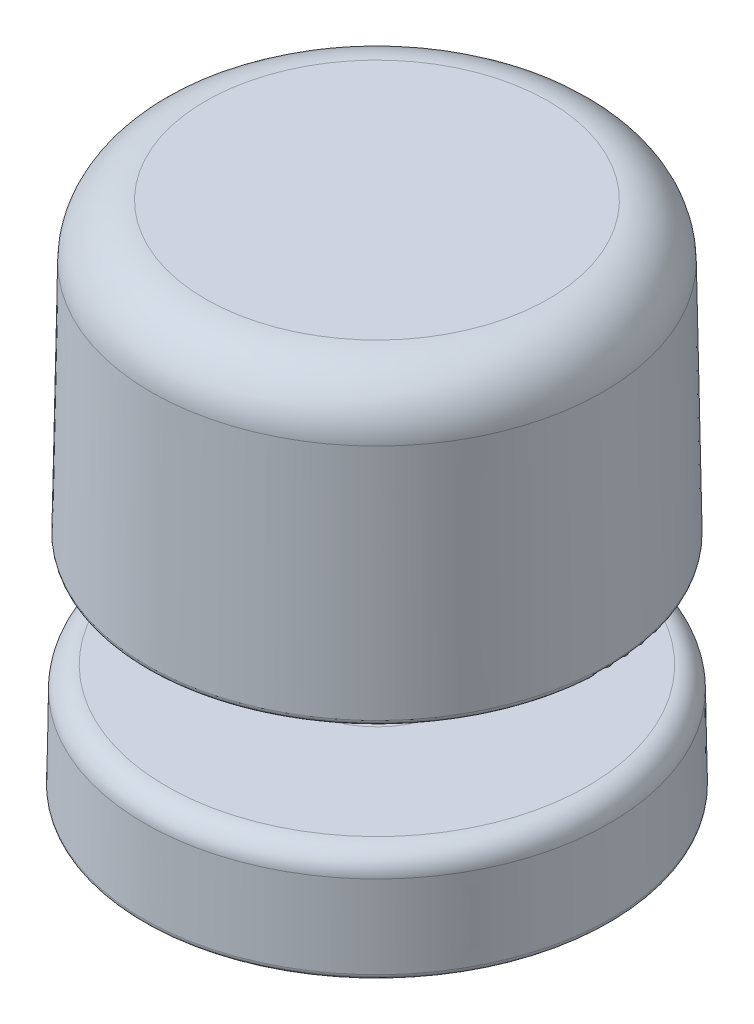
ISO-10303-21;
HEADER;
FILE_DESCRIPTION(('STEP AP214'),'2;1');
FILE_NAME('part.step','',(''),(''),'','','');
FILE_SCHEMA(('AUTOMOTIVE_DESIGN { 1 0 10303 214 1 1 1 1 }'));
ENDSEC;
DATA;
#1=APPLICATION_CONTEXT('core data for automotive mechanical design processes');
#2=APPLICATION_PROTOCOL_DEFINITION('international standard','automotive_design',2000,#1);
#3=PRODUCT_CONTEXT('',#1,'mechanical');
#4=PRODUCT('Part','Part','',(#3));
#5=PRODUCT_RELATED_PRODUCT_CATEGORY('part','',(#4));
#6=PRODUCT_DEFINITION_FORMATION('','',#4);
#7=PRODUCT_DEFINITION_CONTEXT('part definition',#1,'design');
#8=PRODUCT_DEFINITION('design','',#6,#7);
#9=PRODUCT_DEFINITION_SHAPE('','',#8);
#10=(LENGTH_UNIT() NAMED_UNIT(*) SI_UNIT(.MILLI.,.METRE.));
#11=(NAMED_UNIT(*) PLANE_ANGLE_UNIT() SI_UNIT($,.RADIAN.));
#12=(NAMED_UNIT(*) SI_UNIT($,.STERADIAN.) SOLID_ANGLE_UNIT());
#13=UNCERTAINTY_MEASURE_WITH_UNIT(LENGTH_MEASURE(1.E-05),#10,'distance_accuracy_value','');
#14=(GEOMETRIC_REPRESENTATION_CONTEXT(3) GLOBAL_UNCERTAINTY_ASSIGNED_CONTEXT((#13)) GLOBAL_UNIT_ASSIGNED_CONTEXT((#10,
#11,#12)) REPRESENTATION_CONTEXT('',''));
#15=CARTESIAN_POINT('',(0.,0.,0.));
#16=DIRECTION('',(0.,0.,1.));
#17=DIRECTION('',(1.,0.,0.));
#18=AXIS2_PLACEMENT_3D('',#15,#16,#17);
#19=CARTESIAN_POINT('',(0.,47.,0.));
#20=DIRECTION('',(0.,1.,0.));
#21=DIRECTION('',(0.,0.,1.));
#22=AXIS2_PLACEMENT_3D('',#19,#20,#21);
#23=PLANE('',#22);
#24=CARTESIAN_POINT('',(0.,47.,0.));
#25=DIRECTION('',(0.,-1.,0.));
#26=DIRECTION('',(0.,0.,-1.));
#27=AXIS2_PLACEMENT_3D('',#24,#25,#26);
#28=CIRCLE('',#27,15.7661256327968);
#29=CARTESIAN_POINT('',(0.,47.,-15.7661256327968));
#30=VERTEX_POINT('',#29);
#31=EDGE_CURVE('E11',#30,#30,#28,.T.);
#32=ORIENTED_EDGE('',*,*,#31,.F.);
#33=EDGE_LOOP('',(#32));
#34=FACE_BOUND('',#33,.T.);
#35=ADVANCED_FACE('F41',(#34),#23,.T.);
#36=CARTESIAN_POINT('',(0.,42.,0.));
#37=DIRECTION('',(0.,-1.,0.));
#38=DIRECTION('',(0.,0.,-1.));
#39=AXIS2_PLACEMENT_3D('',#36,#37,#38);
#40=TOROIDAL_SURFACE('',#39,15.7661256327968,5.);
#41=ORIENTED_EDGE('',*,*,#31,.T.);
#42=EDGE_LOOP('',(#41));
#43=FACE_BOUND('',#42,.T.);
#44=CARTESIAN_POINT('',(0.,42.0872620321864,0.));
#45=DIRECTION('',(0.,-1.,0.));
#46=DIRECTION('',(0.,0.,-1.));
#47=AXIS2_PLACEMENT_3D('',#44,#45,#46);
#48=CIRCLE('',#47,20.7653641085787);
#49=CARTESIAN_POINT('',(0.,42.0872620321864,-20.7653641085787));
#50=VERTEX_POINT('',#49);
#51=EDGE_CURVE('E47',#50,#50,#48,.T.);
#52=ORIENTED_EDGE('',*,*,#51,.F.);
#53=EDGE_LOOP('',(#52));
#54=FACE_BOUND('',#53,.T.);
#55=ADVANCED_FACE('F100',(#43,#54),#40,.T.);
#56=CARTESIAN_POINT('',(0.,20.5087262032186,0.));
#57=DIRECTION('',(0.,-1.,0.));
#58=DIRECTION('',(0.,0.,-1.));
#59=AXIS2_PLACEMENT_3D('',#56,#57,#58);
#60=CONICAL_SURFACE('',#59,21.1420188525293,0.0174532925199468);
#61=ORIENTED_EDGE('',*,*,#51,.T.);
#62=EDGE_LOOP('',(#61));
#63=FACE_BOUND('',#62,.T.);
#64=CARTESIAN_POINT('',(0.,20.5087262032186,0.));
#65=DIRECTION('',(0.,-1.,0.));
#66=DIRECTION('',(0.,0.,-1.));
#67=AXIS2_PLACEMENT_3D('',#64,#65,#66);
#68=CIRCLE('',#67,21.1420188525293);
#69=CARTESIAN_POINT('',(0.,20.5087262032186,-21.1420188525293));
#70=VERTEX_POINT('',#69);
#71=EDGE_CURVE('E92',#70,#70,#68,.T.);
#72=ORIENTED_EDGE('',*,*,#71,.F.);
#73=EDGE_LOOP('',(#72));
#74=FACE_BOUND('',#73,.T.);
#75=ADVANCED_FACE('F97',(#63,#74),#60,.T.);
#76=CARTESIAN_POINT('',(0.,20.5,0.));
#77=DIRECTION('',(0.,-1.,0.));
#78=DIRECTION('',(0.,0.,-1.));
#79=AXIS2_PLACEMENT_3D('',#76,#77,#78);
#80=TOROIDAL_SURFACE('',#79,20.6420950049511,0.500000000000001);
#81=ORIENTED_EDGE('',*,*,#71,.T.);
#82=EDGE_LOOP('',(#81));
#83=FACE_BOUND('',#82,.T.);
#84=CARTESIAN_POINT('',(0.,20.,0.));
#85=DIRECTION('',(0.,-1.,0.));
#86=DIRECTION('',(0.,0.,-1.));
#87=AXIS2_PLACEMENT_3D('',#84,#85,#86);
#88=CIRCLE('',#87,20.6420950049511);
#89=CARTESIAN_POINT('',(0.,20.,-20.6420950049511));
#90=VERTEX_POINT('',#89);
#91=EDGE_CURVE('E89',#90,#90,#88,.T.);
#92=ORIENTED_EDGE('',*,*,#91,.F.);
#93=EDGE_LOOP('',(#92));
#94=FACE_BOUND('',#93,.T.);
#95=ADVANCED_FACE('F107',(#83,#94),#80,.T.);
#96=CARTESIAN_POINT('',(20.6420950049511,20.,0.));
#97=DIRECTION('',(0.,-1.,0.));
#98=DIRECTION('',(0.,0.,-1.));
#99=AXIS2_PLACEMENT_3D('',#96,#97,#98);
#100=PLANE('',#99);
#101=ORIENTED_EDGE('',*,*,#91,.T.);
#102=EDGE_LOOP('',(#101));
#103=FACE_BOUND('',#102,.T.);
#104=CARTESIAN_POINT('',(0.,20.,0.));
#105=DIRECTION('',(0.,-1.,0.));
#106=DIRECTION('',(0.,0.,-1.));
#107=AXIS2_PLACEMENT_3D('',#104,#105,#106);
#108=CIRCLE('',#107,7.00000000000002);
#109=CARTESIAN_POINT('',(0.,20.,-7.00000000000002));
#110=VERTEX_POINT('',#109);
#111=EDGE_CURVE('E86',#110,#110,#108,.T.);
#112=ORIENTED_EDGE('',*,*,#111,.F.);
#113=EDGE_LOOP('',(#112));
#114=FACE_BOUND('',#113,.T.);
#115=ADVANCED_FACE('F113',(#103,#114),#100,.T.);
#116=CARTESIAN_POINT('',(0.,18.,0.));
#117=DIRECTION('',(0.,-1.,0.));
#118=DIRECTION('',(0.,0.,-1.));
#119=AXIS2_PLACEMENT_3D('',#116,#117,#118);
#120=TOROIDAL_SURFACE('',#119,7.,2.);
#121=ORIENTED_EDGE('',*,*,#111,.T.);
#122=EDGE_LOOP('',(#121));
#123=FACE_BOUND('',#122,.T.);
#124=CARTESIAN_POINT('',(0.,18.,0.));
#125=DIRECTION('',(0.,-1.,0.));
#126=DIRECTION('',(0.,0.,-1.));
#127=AXIS2_PLACEMENT_3D('',#124,#125,#126);
#128=CIRCLE('',#127,5.00000000000001);
#129=CARTESIAN_POINT('',(0.,18.,-5.00000000000001));
#130=VERTEX_POINT('',#129);
#131=EDGE_CURVE('E83',#130,#130,#128,.T.);
#132=ORIENTED_EDGE('',*,*,#131,.F.);
#133=EDGE_LOOP('',(#132));
#134=FACE_BOUND('',#133,.T.);
#135=ADVANCED_FACE('F117',(#123,#134),#120,.F.);
#136=CARTESIAN_POINT('',(0.,0.,0.));
#137=DIRECTION('',(0.,-1.,0.));
#138=DIRECTION('',(0.,0.,-1.));
#139=AXIS2_PLACEMENT_3D('',#136,#137,#138);
#140=CYLINDRICAL_SURFACE('',#139,5.);
#141=ORIENTED_EDGE('',*,*,#131,.T.);
#142=EDGE_LOOP('',(#141));
#143=FACE_BOUND('',#142,.T.);
#144=CARTESIAN_POINT('',(0.,12.,0.));
#145=DIRECTION('',(0.,-1.,0.));
#146=DIRECTION('',(0.,0.,-1.));
#147=AXIS2_PLACEMENT_3D('',#144,#145,#146);
#148=CIRCLE('',#147,5.);
#149=CARTESIAN_POINT('',(0.,12.,-5.));
#150=VERTEX_POINT('',#149);
#151=EDGE_CURVE('E80',#150,#150,#148,.T.);
#152=ORIENTED_EDGE('',*,*,#151,.F.);
#153=EDGE_LOOP('',(#152));
#154=FACE_BOUND('',#153,.T.);
#155=ADVANCED_FACE('F121',(#143,#154),#140,.T.);
#156=CARTESIAN_POINT('',(0.,12.,0.));
#157=DIRECTION('',(0.,-1.,0.));
#158=DIRECTION('',(0.,0.,-1.));
#159=AXIS2_PLACEMENT_3D('',#156,#157,#158);
#160=TOROIDAL_SURFACE('',#159,7.,2.);
#161=ORIENTED_EDGE('',*,*,#151,.T.);
#162=EDGE_LOOP('',(#161));
#163=FACE_BOUND('',#162,.T.);
#164=CARTESIAN_POINT('',(0.,10.,0.));
#165=DIRECTION('',(0.,-1.,0.));
#166=DIRECTION('',(0.,0.,-1.));
#167=AXIS2_PLACEMENT_3D('',#164,#165,#166);
#168=CIRCLE('',#167,7.00000000000002);
#169=CARTESIAN_POINT('',(0.,10.,-7.00000000000002));
#170=VERTEX_POINT('',#169);
#171=EDGE_CURVE('E77',#170,#170,#168,.T.);
#172=ORIENTED_EDGE('',*,*,#171,.F.);
#173=EDGE_LOOP('',(#172));
#174=FACE_BOUND('',#173,.T.);
#175=ADVANCED_FACE('F125',(#163,#174),#160,.F.);
#176=CARTESIAN_POINT('',(7.00000000000002,10.,0.));
#177=DIRECTION('',(0.,1.,0.));
#178=DIRECTION('',(0.,0.,1.));
#179=AXIS2_PLACEMENT_3D('',#176,#177,#178);
#180=PLANE('',#179);
#181=ORIENTED_EDGE('',*,*,#171,.T.);
#182=EDGE_LOOP('',(#181));
#183=FACE_BOUND('',#182,.T.);
#184=CARTESIAN_POINT('',(0.,10.,0.));
#185=DIRECTION('',(0.,-1.,0.));
#186=DIRECTION('',(0.,0.,-1.));
#187=AXIS2_PLACEMENT_3D('',#184,#185,#186);
#188=CIRCLE('',#187,19.360054824488);
#189=CARTESIAN_POINT('',(0.,10.,-19.360054824488));
#190=VERTEX_POINT('',#189);
#191=EDGE_CURVE('E74',#190,#190,#188,.T.);
#192=ORIENTED_EDGE('',*,*,#191,.F.);
#193=EDGE_LOOP('',(#192));
#194=FACE_BOUND('',#193,.T.);
#195=ADVANCED_FACE('F129',(#183,#194),#180,.T.);
#196=CARTESIAN_POINT('',(0.,8.,0.));
#197=DIRECTION('',(0.,-1.,0.));
#198=DIRECTION('',(0.,0.,-1.));
#199=AXIS2_PLACEMENT_3D('',#196,#197,#198);
#200=TOROIDAL_SURFACE('',#199,19.360054824488,2.);
#201=ORIENTED_EDGE('',*,*,#191,.T.);
#202=EDGE_LOOP('',(#201));
#203=FACE_BOUND('',#202,.T.);
#204=CARTESIAN_POINT('',(0.,8.03490481287457,0.));
#205=DIRECTION('',(0.,-1.,0.));
#206=DIRECTION('',(0.,0.,-1.));
#207=AXIS2_PLACEMENT_3D('',#204,#205,#206);
#208=CIRCLE('',#207,21.3597502148008);
#209=CARTESIAN_POINT('',(0.,8.03490481287457,-21.3597502148008));
#210=VERTEX_POINT('',#209);
#211=EDGE_CURVE('E71',#210,#210,#208,.T.);
#212=ORIENTED_EDGE('',*,*,#211,.F.);
#213=EDGE_LOOP('',(#212));
#214=FACE_BOUND('',#213,.T.);
#215=ADVANCED_FACE('F133',(#203,#214),#200,.T.);
#216=CARTESIAN_POINT('',(0.,0.508726203218647,0.));
#217=DIRECTION('',(0.,-1.,0.));
#218=DIRECTION('',(0.,0.,-1.));
#219=AXIS2_PLACEMENT_3D('',#216,#217,#218);
#220=CONICAL_SURFACE('',#219,21.4911201510937,0.017453292519947);
#221=ORIENTED_EDGE('',*,*,#211,.T.);
#222=EDGE_LOOP('',(#221));
#223=FACE_BOUND('',#222,.T.);
#224=CARTESIAN_POINT('',(0.,0.508726203218647,0.));
#225=DIRECTION('',(0.,-1.,0.));
#226=DIRECTION('',(0.,0.,-1.));
#227=AXIS2_PLACEMENT_3D('',#224,#225,#226);
#228=CIRCLE('',#227,21.4911201510937);
#229=CARTESIAN_POINT('',(0.,0.508726203218647,-21.4911201510937));
#230=VERTEX_POINT('',#229);
#231=EDGE_CURVE('E64',#230,#230,#228,.T.);
#232=ORIENTED_EDGE('',*,*,#231,.F.);
#233=EDGE_LOOP('',(#232));
#234=FACE_BOUND('',#233,.T.);
#235=ADVANCED_FACE('F137',(#223,#234),#220,.T.);
#236=CARTESIAN_POINT('',(0.,0.5,0.));
#237=DIRECTION('',(0.,-1.,0.));
#238=DIRECTION('',(0.,0.,-1.));
#239=AXIS2_PLACEMENT_3D('',#236,#237,#238);
#240=TOROIDAL_SURFACE('',#239,20.9911963035155,0.500000000000001);
#241=ORIENTED_EDGE('',*,*,#231,.T.);
#242=EDGE_LOOP('',(#241));
#243=FACE_BOUND('',#242,.T.);
#244=CARTESIAN_POINT('',(0.,0.,0.));
#245=DIRECTION('',(0.,-1.,0.));
#246=DIRECTION('',(0.,0.,-1.));
#247=AXIS2_PLACEMENT_3D('',#244,#245,#246);
#248=CIRCLE('',#247,20.9911963035155);
#249=CARTESIAN_POINT('',(0.,0.,-20.9911963035155));
#250=VERTEX_POINT('',#249);
#251=EDGE_CURVE('E60',#250,#250,#248,.T.);
#252=ORIENTED_EDGE('',*,*,#251,.F.);
#253=EDGE_LOOP('',(#252));
#254=FACE_BOUND('',#253,.T.);
#255=ADVANCED_FACE('F141',(#243,#254),#240,.T.);
#256=CARTESIAN_POINT('',(20.9911963035155,0.,0.));
#257=DIRECTION('',(0.,-1.,0.));
#258=DIRECTION('',(0.,0.,-1.));
#259=AXIS2_PLACEMENT_3D('',#256,#257,#258);
#260=PLANE('',#259);
#261=CARTESIAN_POINT('',(0.,0.,0.));
#262=DIRECTION('',(0.,-1.,0.));
#263=DIRECTION('',(0.,0.,-1.));
#264=AXIS2_PLACEMENT_3D('',#261,#262,#263);
#265=CIRCLE('',#264,3.17499999999999);
#266=CARTESIAN_POINT('',(0.,0.,-3.17499999999999));
#267=VERTEX_POINT('',#266);
#268=EDGE_CURVE('E61',#267,#267,#265,.T.);
#269=ORIENTED_EDGE('',*,*,#268,.F.);
#270=EDGE_LOOP('',(#269));
#271=FACE_BOUND('',#270,.T.);
#272=ORIENTED_EDGE('',*,*,#251,.T.);
#273=EDGE_LOOP('',(#272));
#274=FACE_BOUND('',#273,.T.);
#275=ADVANCED_FACE('F54',(#271,#274),#260,.T.);
#276=CARTESIAN_POINT('',(0.,9.99999999999999,0.));
#277=DIRECTION('',(0.,-1.,0.));
#278=DIRECTION('',(0.,0.,-1.));
#279=AXIS2_PLACEMENT_3D('',#276,#277,#278);
#280=CONICAL_SURFACE('',#279,3.17499999999999,1.02974425867665);
#281=CARTESIAN_POINT('',(0.,11.9077324654125,0.));
#282=VERTEX_POINT('',#281);
#283=VERTEX_LOOP('',#282);
#284=FACE_BOUND('',#283,.T.);
#285=CARTESIAN_POINT('',(0.,9.99999999999999,0.));
#286=DIRECTION('',(0.,-1.,0.));
#287=DIRECTION('',(0.,0.,-1.));
#288=AXIS2_PLACEMENT_3D('',#285,#286,#287);
#289=CIRCLE('',#288,3.17499999999999);
#290=CARTESIAN_POINT('',(0.,9.99999999999999,-3.17499999999999));
#291=VERTEX_POINT('',#290);
#292=EDGE_CURVE('E58',#291,#291,#289,.T.);
#293=ORIENTED_EDGE('',*,*,#292,.T.);
#294=EDGE_LOOP('',(#293));
#295=FACE_BOUND('',#294,.T.);
#296=ADVANCED_FACE('F50',(#284,#295),#280,.F.);
#297=CARTESIAN_POINT('',(0.,0.,0.));
#298=DIRECTION('',(0.,-1.,0.));
#299=DIRECTION('',(0.,0.,-1.));
#300=AXIS2_PLACEMENT_3D('',#297,#298,#299);
#301=CYLINDRICAL_SURFACE('',#300,3.17499999999999);
#302=ORIENTED_EDGE('',*,*,#292,.F.);
#303=EDGE_LOOP('',(#302));
#304=FACE_BOUND('',#303,.T.);
#305=ORIENTED_EDGE('',*,*,#268,.T.);
#306=EDGE_LOOP('',(#305));
#307=FACE_BOUND('',#306,.T.);
#308=ADVANCED_FACE('F53',(#304,#307),#301,.F.);
#309=CLOSED_SHELL('',(#35,#55,#75,#95,#115,#135,#155,#175,#195,#215,#235,#255,#275,#296,#308));
#310=MANIFOLD_SOLID_BREP('B2',#309);
#311=ADVANCED_BREP_SHAPE_REPRESENTATION('',(#18,#310),#14);
#312=SHAPE_DEFINITION_REPRESENTATION(#9,#311);
ENDSEC;
END-ISO-10303-21;
